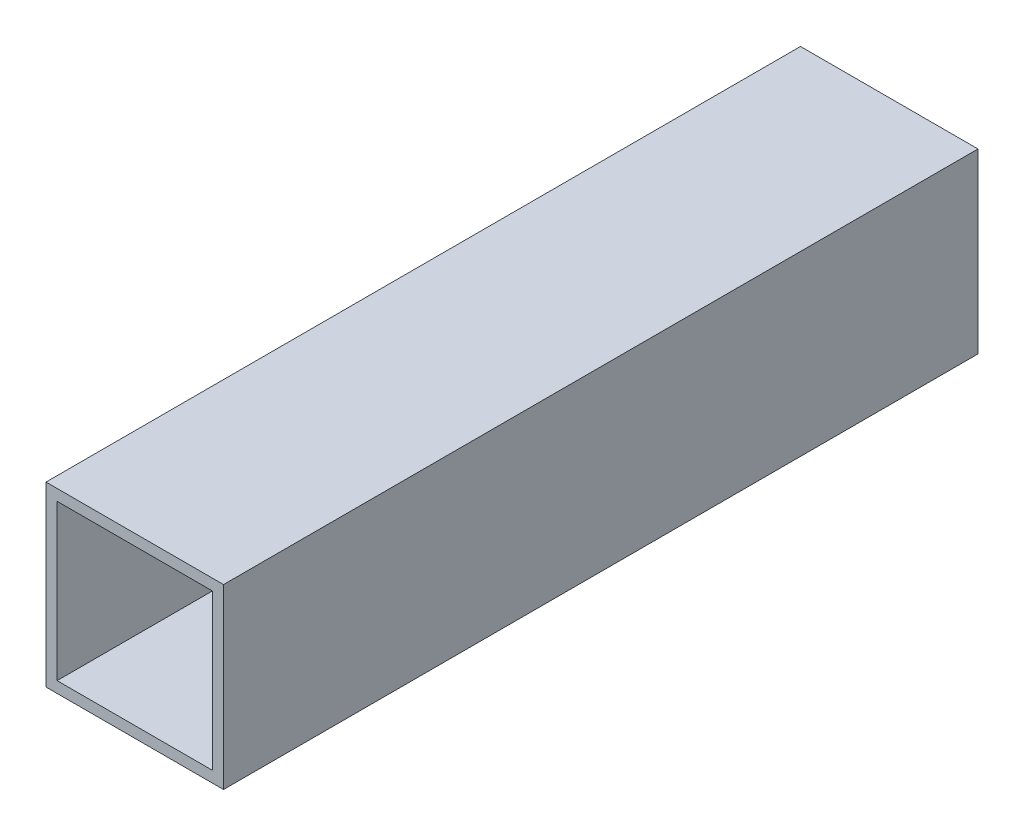
ISO-10303-21;
HEADER;
FILE_DESCRIPTION(('STEP AP214'),'2;1');
FILE_NAME('part.step','',(''),(''),'','','');
FILE_SCHEMA(('AUTOMOTIVE_DESIGN { 1 0 10303 214 1 1 1 1 }'));
ENDSEC;
DATA;
#1=APPLICATION_CONTEXT('core data for automotive mechanical design processes');
#2=APPLICATION_PROTOCOL_DEFINITION('international standard','automotive_design',2000,#1);
#3=PRODUCT_CONTEXT('',#1,'mechanical');
#4=PRODUCT('Part','Part','',(#3));
#5=PRODUCT_RELATED_PRODUCT_CATEGORY('part','',(#4));
#6=PRODUCT_DEFINITION_FORMATION('','',#4);
#7=PRODUCT_DEFINITION_CONTEXT('part definition',#1,'design');
#8=PRODUCT_DEFINITION('design','',#6,#7);
#9=PRODUCT_DEFINITION_SHAPE('','',#8);
#10=(LENGTH_UNIT() NAMED_UNIT(*) SI_UNIT(.MILLI.,.METRE.));
#11=(NAMED_UNIT(*) PLANE_ANGLE_UNIT() SI_UNIT($,.RADIAN.));
#12=(NAMED_UNIT(*) SI_UNIT($,.STERADIAN.) SOLID_ANGLE_UNIT());
#13=UNCERTAINTY_MEASURE_WITH_UNIT(LENGTH_MEASURE(1.E-05),#10,'distance_accuracy_value','');
#14=(GEOMETRIC_REPRESENTATION_CONTEXT(3) GLOBAL_UNCERTAINTY_ASSIGNED_CONTEXT((#13)) GLOBAL_UNIT_ASSIGNED_CONTEXT((#10,
#11,#12)) REPRESENTATION_CONTEXT('',''));
#15=CARTESIAN_POINT('',(0.,0.,0.));
#16=DIRECTION('',(0.,0.,1.));
#17=DIRECTION('',(1.,0.,0.));
#18=AXIS2_PLACEMENT_3D('',#15,#16,#17);
#19=CARTESIAN_POINT('',(0.,0.,215.9));
#20=DIRECTION('',(0.,0.,-1.));
#21=DIRECTION('',(-1.,0.,0.));
#22=AXIS2_PLACEMENT_3D('',#19,#20,#21);
#23=PLANE('',#22);
#24=DIRECTION('',(0.,1.,0.));
#25=VECTOR('',#24,1.);
#26=CARTESIAN_POINT('',(25.4,-25.4,215.9));
#27=LINE('',#26,#25);
#28=CARTESIAN_POINT('',(25.4,-25.4,215.9));
#29=VERTEX_POINT('',#28);
#30=CARTESIAN_POINT('',(25.4,25.4,215.9));
#31=VERTEX_POINT('',#30);
#32=EDGE_CURVE('E133',#29,#31,#27,.T.);
#33=ORIENTED_EDGE('',*,*,#32,.T.);
#34=DIRECTION('',(-1.,0.,0.));
#35=VECTOR('',#34,1.);
#36=CARTESIAN_POINT('',(-25.4,25.4,215.9));
#37=LINE('',#36,#35);
#38=CARTESIAN_POINT('',(-25.4,25.4,215.9));
#39=VERTEX_POINT('',#38);
#40=EDGE_CURVE('E136',#31,#39,#37,.T.);
#41=ORIENTED_EDGE('',*,*,#40,.T.);
#42=DIRECTION('',(0.,-1.,0.));
#43=VECTOR('',#42,1.);
#44=CARTESIAN_POINT('',(-25.4,-25.4,215.9));
#45=LINE('',#44,#43);
#46=CARTESIAN_POINT('',(-25.4,-25.4,215.9));
#47=VERTEX_POINT('',#46);
#48=EDGE_CURVE('E139',#39,#47,#45,.T.);
#49=ORIENTED_EDGE('',*,*,#48,.T.);
#50=DIRECTION('',(1.,0.,0.));
#51=VECTOR('',#50,1.);
#52=CARTESIAN_POINT('',(-25.4,-25.4,215.9));
#53=LINE('',#52,#51);
#54=EDGE_CURVE('E141',#47,#29,#53,.T.);
#55=ORIENTED_EDGE('',*,*,#54,.T.);
#56=EDGE_LOOP('',(#33,#41,#49,#55));
#57=FACE_BOUND('',#56,.T.);
#58=DIRECTION('',(0.,-1.,0.));
#59=VECTOR('',#58,1.);
#60=CARTESIAN_POINT('',(-22.225,-22.225,215.9));
#61=LINE('',#60,#59);
#62=CARTESIAN_POINT('',(-22.225,22.225,215.9));
#63=VERTEX_POINT('',#62);
#64=CARTESIAN_POINT('',(-22.225,-22.225,215.9));
#65=VERTEX_POINT('',#64);
#66=EDGE_CURVE('E97',#63,#65,#61,.T.);
#67=ORIENTED_EDGE('',*,*,#66,.F.);
#68=DIRECTION('',(-1.,0.,0.));
#69=VECTOR('',#68,1.);
#70=CARTESIAN_POINT('',(-22.225,22.225,215.9));
#71=LINE('',#70,#69);
#72=CARTESIAN_POINT('',(22.225,22.225,215.9));
#73=VERTEX_POINT('',#72);
#74=EDGE_CURVE('E119',#73,#63,#71,.T.);
#75=ORIENTED_EDGE('',*,*,#74,.F.);
#76=DIRECTION('',(0.,1.,0.));
#77=VECTOR('',#76,1.);
#78=CARTESIAN_POINT('',(22.225,-22.225,215.9));
#79=LINE('',#78,#77);
#80=CARTESIAN_POINT('',(22.225,-22.225,215.9));
#81=VERTEX_POINT('',#80);
#82=EDGE_CURVE('E117',#81,#73,#79,.T.);
#83=ORIENTED_EDGE('',*,*,#82,.F.);
#84=DIRECTION('',(1.,0.,0.));
#85=VECTOR('',#84,1.);
#86=CARTESIAN_POINT('',(-22.225,-22.225,215.9));
#87=LINE('',#86,#85);
#88=EDGE_CURVE('E105',#65,#81,#87,.T.);
#89=ORIENTED_EDGE('',*,*,#88,.F.);
#90=EDGE_LOOP('',(#67,#75,#83,#89));
#91=FACE_BOUND('',#90,.T.);
#92=ADVANCED_FACE('F32',(#57,#91),#23,.F.);
#93=CARTESIAN_POINT('',(0.,0.,0.));
#94=DIRECTION('',(0.,0.,-1.));
#95=DIRECTION('',(-1.,0.,0.));
#96=AXIS2_PLACEMENT_3D('',#93,#94,#95);
#97=PLANE('',#96);
#98=DIRECTION('',(0.,1.,0.));
#99=VECTOR('',#98,1.);
#100=CARTESIAN_POINT('',(25.4,-25.4,0.));
#101=LINE('',#100,#99);
#102=CARTESIAN_POINT('',(25.4,-25.4,0.));
#103=VERTEX_POINT('',#102);
#104=CARTESIAN_POINT('',(25.4,25.4,0.));
#105=VERTEX_POINT('',#104);
#106=EDGE_CURVE('E113',#103,#105,#101,.T.);
#107=ORIENTED_EDGE('',*,*,#106,.F.);
#108=DIRECTION('',(1.,0.,0.));
#109=VECTOR('',#108,1.);
#110=CARTESIAN_POINT('',(-25.4,-25.4,0.));
#111=LINE('',#110,#109);
#112=CARTESIAN_POINT('',(-25.4,-25.4,0.));
#113=VERTEX_POINT('',#112);
#114=EDGE_CURVE('E137',#113,#103,#111,.T.);
#115=ORIENTED_EDGE('',*,*,#114,.F.);
#116=DIRECTION('',(0.,-1.,0.));
#117=VECTOR('',#116,1.);
#118=CARTESIAN_POINT('',(-25.4,-25.4,0.));
#119=LINE('',#118,#117);
#120=CARTESIAN_POINT('',(-25.4,25.4,0.));
#121=VERTEX_POINT('',#120);
#122=EDGE_CURVE('E148',#121,#113,#119,.T.);
#123=ORIENTED_EDGE('',*,*,#122,.F.);
#124=DIRECTION('',(-1.,0.,0.));
#125=VECTOR('',#124,1.);
#126=CARTESIAN_POINT('',(-25.4,25.4,0.));
#127=LINE('',#126,#125);
#128=EDGE_CURVE('E146',#105,#121,#127,.T.);
#129=ORIENTED_EDGE('',*,*,#128,.F.);
#130=EDGE_LOOP('',(#107,#115,#123,#129));
#131=FACE_BOUND('',#130,.T.);
#132=DIRECTION('',(-1.,0.,0.));
#133=VECTOR('',#132,1.);
#134=CARTESIAN_POINT('',(-22.225,22.225,0.));
#135=LINE('',#134,#133);
#136=CARTESIAN_POINT('',(22.225,22.225,0.));
#137=VERTEX_POINT('',#136);
#138=CARTESIAN_POINT('',(-22.225,22.225,0.));
#139=VERTEX_POINT('',#138);
#140=EDGE_CURVE('E106',#137,#139,#135,.T.);
#141=ORIENTED_EDGE('',*,*,#140,.T.);
#142=DIRECTION('',(0.,-1.,0.));
#143=VECTOR('',#142,1.);
#144=CARTESIAN_POINT('',(-22.225,-22.225,0.));
#145=LINE('',#144,#143);
#146=CARTESIAN_POINT('',(-22.225,-22.225,0.));
#147=VERTEX_POINT('',#146);
#148=EDGE_CURVE('E55',#139,#147,#145,.T.);
#149=ORIENTED_EDGE('',*,*,#148,.T.);
#150=DIRECTION('',(1.,0.,0.));
#151=VECTOR('',#150,1.);
#152=CARTESIAN_POINT('',(-22.225,-22.225,0.));
#153=LINE('',#152,#151);
#154=CARTESIAN_POINT('',(22.225,-22.225,0.));
#155=VERTEX_POINT('',#154);
#156=EDGE_CURVE('E112',#147,#155,#153,.T.);
#157=ORIENTED_EDGE('',*,*,#156,.T.);
#158=DIRECTION('',(0.,1.,0.));
#159=VECTOR('',#158,1.);
#160=CARTESIAN_POINT('',(22.225,-22.225,0.));
#161=LINE('',#160,#159);
#162=EDGE_CURVE('E125',#155,#137,#161,.T.);
#163=ORIENTED_EDGE('',*,*,#162,.T.);
#164=EDGE_LOOP('',(#141,#149,#157,#163));
#165=FACE_BOUND('',#164,.T.);
#166=ADVANCED_FACE('F166',(#131,#165),#97,.T.);
#167=CARTESIAN_POINT('',(25.4,-25.4,215.9));
#168=DIRECTION('',(-1.,0.,0.));
#169=DIRECTION('',(0.,0.,1.));
#170=AXIS2_PLACEMENT_3D('',#167,#168,#169);
#171=PLANE('',#170);
#172=ORIENTED_EDGE('',*,*,#106,.T.);
#173=DIRECTION('',(0.,0.,-1.));
#174=VECTOR('',#173,1.);
#175=CARTESIAN_POINT('',(25.4,25.4,215.9));
#176=LINE('',#175,#174);
#177=EDGE_CURVE('E11',#31,#105,#176,.T.);
#178=ORIENTED_EDGE('',*,*,#177,.F.);
#179=ORIENTED_EDGE('',*,*,#32,.F.);
#180=DIRECTION('',(0.,0.,-1.));
#181=VECTOR('',#180,1.);
#182=CARTESIAN_POINT('',(25.4,-25.4,215.9));
#183=LINE('',#182,#181);
#184=EDGE_CURVE('E143',#29,#103,#183,.T.);
#185=ORIENTED_EDGE('',*,*,#184,.T.);
#186=EDGE_LOOP('',(#172,#178,#179,#185));
#187=FACE_BOUND('',#186,.T.);
#188=ADVANCED_FACE('F34',(#187),#171,.F.);
#189=CARTESIAN_POINT('',(-25.4,25.4,215.9));
#190=DIRECTION('',(0.,-1.,0.));
#191=DIRECTION('',(0.,0.,-1.));
#192=AXIS2_PLACEMENT_3D('',#189,#190,#191);
#193=PLANE('',#192);
#194=ORIENTED_EDGE('',*,*,#128,.T.);
#195=DIRECTION('',(0.,0.,-1.));
#196=VECTOR('',#195,1.);
#197=CARTESIAN_POINT('',(-25.4,25.4,215.9));
#198=LINE('',#197,#196);
#199=EDGE_CURVE('E40',#39,#121,#198,.T.);
#200=ORIENTED_EDGE('',*,*,#199,.F.);
#201=ORIENTED_EDGE('',*,*,#40,.F.);
#202=ORIENTED_EDGE('',*,*,#177,.T.);
#203=EDGE_LOOP('',(#194,#200,#201,#202));
#204=FACE_BOUND('',#203,.T.);
#205=ADVANCED_FACE('F176',(#204),#193,.F.);
#206=CARTESIAN_POINT('',(-25.4,-25.4,215.9));
#207=DIRECTION('',(1.,0.,0.));
#208=DIRECTION('',(0.,0.,-1.));
#209=AXIS2_PLACEMENT_3D('',#206,#207,#208);
#210=PLANE('',#209);
#211=ORIENTED_EDGE('',*,*,#122,.T.);
#212=DIRECTION('',(0.,0.,-1.));
#213=VECTOR('',#212,1.);
#214=CARTESIAN_POINT('',(-25.4,-25.4,215.9));
#215=LINE('',#214,#213);
#216=EDGE_CURVE('E153',#47,#113,#215,.T.);
#217=ORIENTED_EDGE('',*,*,#216,.F.);
#218=ORIENTED_EDGE('',*,*,#48,.F.);
#219=ORIENTED_EDGE('',*,*,#199,.T.);
#220=EDGE_LOOP('',(#211,#217,#218,#219));
#221=FACE_BOUND('',#220,.T.);
#222=ADVANCED_FACE('F160',(#221),#210,.F.);
#223=CARTESIAN_POINT('',(-25.4,-25.4,215.9));
#224=DIRECTION('',(0.,1.,0.));
#225=DIRECTION('',(0.,0.,1.));
#226=AXIS2_PLACEMENT_3D('',#223,#224,#225);
#227=PLANE('',#226);
#228=ORIENTED_EDGE('',*,*,#114,.T.);
#229=ORIENTED_EDGE('',*,*,#184,.F.);
#230=ORIENTED_EDGE('',*,*,#54,.F.);
#231=ORIENTED_EDGE('',*,*,#216,.T.);
#232=EDGE_LOOP('',(#228,#229,#230,#231));
#233=FACE_BOUND('',#232,.T.);
#234=ADVANCED_FACE('F170',(#233),#227,.F.);
#235=CARTESIAN_POINT('',(-22.225,-22.225,215.9));
#236=DIRECTION('',(1.,0.,0.));
#237=DIRECTION('',(0.,0.,-1.));
#238=AXIS2_PLACEMENT_3D('',#235,#236,#237);
#239=PLANE('',#238);
#240=ORIENTED_EDGE('',*,*,#148,.F.);
#241=DIRECTION('',(0.,0.,-1.));
#242=VECTOR('',#241,1.);
#243=CARTESIAN_POINT('',(-22.225,22.225,215.9));
#244=LINE('',#243,#242);
#245=EDGE_CURVE('E101',#63,#139,#244,.T.);
#246=ORIENTED_EDGE('',*,*,#245,.F.);
#247=ORIENTED_EDGE('',*,*,#66,.T.);
#248=DIRECTION('',(0.,0.,-1.));
#249=VECTOR('',#248,1.);
#250=CARTESIAN_POINT('',(-22.225,-22.225,215.9));
#251=LINE('',#250,#249);
#252=EDGE_CURVE('E100',#65,#147,#251,.T.);
#253=ORIENTED_EDGE('',*,*,#252,.T.);
#254=EDGE_LOOP('',(#240,#246,#247,#253));
#255=FACE_BOUND('',#254,.T.);
#256=ADVANCED_FACE('F99',(#255),#239,.T.);
#257=CARTESIAN_POINT('',(-22.225,-22.225,215.9));
#258=DIRECTION('',(0.,1.,0.));
#259=DIRECTION('',(0.,0.,1.));
#260=AXIS2_PLACEMENT_3D('',#257,#258,#259);
#261=PLANE('',#260);
#262=ORIENTED_EDGE('',*,*,#156,.F.);
#263=ORIENTED_EDGE('',*,*,#252,.F.);
#264=ORIENTED_EDGE('',*,*,#88,.T.);
#265=DIRECTION('',(0.,0.,-1.));
#266=VECTOR('',#265,1.);
#267=CARTESIAN_POINT('',(22.225,-22.225,215.9));
#268=LINE('',#267,#266);
#269=EDGE_CURVE('E114',#81,#155,#268,.T.);
#270=ORIENTED_EDGE('',*,*,#269,.T.);
#271=EDGE_LOOP('',(#262,#263,#264,#270));
#272=FACE_BOUND('',#271,.T.);
#273=ADVANCED_FACE('F109',(#272),#261,.T.);
#274=CARTESIAN_POINT('',(22.225,-22.225,215.9));
#275=DIRECTION('',(-1.,0.,0.));
#276=DIRECTION('',(0.,-1.,0.));
#277=AXIS2_PLACEMENT_3D('',#274,#275,#276);
#278=PLANE('',#277);
#279=ORIENTED_EDGE('',*,*,#162,.F.);
#280=ORIENTED_EDGE('',*,*,#269,.F.);
#281=ORIENTED_EDGE('',*,*,#82,.T.);
#282=DIRECTION('',(0.,0.,-1.));
#283=VECTOR('',#282,1.);
#284=CARTESIAN_POINT('',(22.225,22.225,215.9));
#285=LINE('',#284,#283);
#286=EDGE_CURVE('E47',#73,#137,#285,.T.);
#287=ORIENTED_EDGE('',*,*,#286,.T.);
#288=EDGE_LOOP('',(#279,#280,#281,#287));
#289=FACE_BOUND('',#288,.T.);
#290=ADVANCED_FACE('F199',(#289),#278,.T.);
#291=CARTESIAN_POINT('',(-22.225,22.225,215.9));
#292=DIRECTION('',(0.,-1.,0.));
#293=DIRECTION('',(1.,0.,0.));
#294=AXIS2_PLACEMENT_3D('',#291,#292,#293);
#295=PLANE('',#294);
#296=ORIENTED_EDGE('',*,*,#140,.F.);
#297=ORIENTED_EDGE('',*,*,#286,.F.);
#298=ORIENTED_EDGE('',*,*,#74,.T.);
#299=ORIENTED_EDGE('',*,*,#245,.T.);
#300=EDGE_LOOP('',(#296,#297,#298,#299));
#301=FACE_BOUND('',#300,.T.);
#302=ADVANCED_FACE('F203',(#301),#295,.T.);
#303=CLOSED_SHELL('',(#92,#166,#188,#205,#222,#234,#256,#273,#290,#302));
#304=MANIFOLD_SOLID_BREP('B2',#303);
#305=ADVANCED_BREP_SHAPE_REPRESENTATION('',(#18,#304),#14);
#306=SHAPE_DEFINITION_REPRESENTATION(#9,#305);
ENDSEC;
END-ISO-10303-21;
